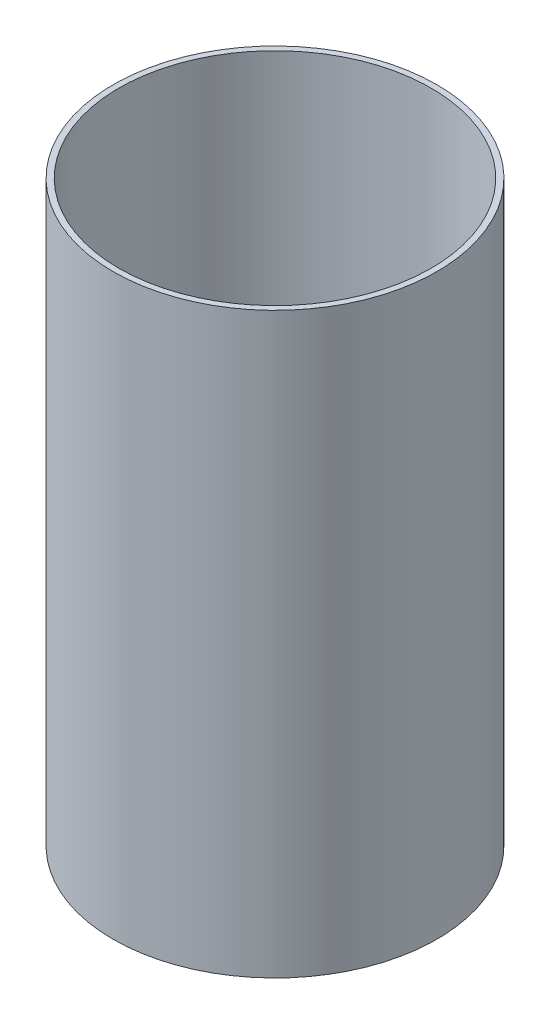
ISO-10303-21;
HEADER;
FILE_DESCRIPTION(('STEP AP214'),'2;1');
FILE_NAME('part.step','',(''),(''),'','','');
FILE_SCHEMA(('AUTOMOTIVE_DESIGN { 1 0 10303 214 1 1 1 1 }'));
ENDSEC;
DATA;
#1=APPLICATION_CONTEXT('core data for automotive mechanical design processes');
#2=APPLICATION_PROTOCOL_DEFINITION('international standard','automotive_design',2000,#1);
#3=PRODUCT_CONTEXT('',#1,'mechanical');
#4=PRODUCT('Part','Part','',(#3));
#5=PRODUCT_RELATED_PRODUCT_CATEGORY('part','',(#4));
#6=PRODUCT_DEFINITION_FORMATION('','',#4);
#7=PRODUCT_DEFINITION_CONTEXT('part definition',#1,'design');
#8=PRODUCT_DEFINITION('design','',#6,#7);
#9=PRODUCT_DEFINITION_SHAPE('','',#8);
#10=(LENGTH_UNIT() NAMED_UNIT(*) SI_UNIT(.MILLI.,.METRE.));
#11=(NAMED_UNIT(*) PLANE_ANGLE_UNIT() SI_UNIT($,.RADIAN.));
#12=(NAMED_UNIT(*) SI_UNIT($,.STERADIAN.) SOLID_ANGLE_UNIT());
#13=UNCERTAINTY_MEASURE_WITH_UNIT(LENGTH_MEASURE(1.E-05),#10,'distance_accuracy_value','');
#14=(GEOMETRIC_REPRESENTATION_CONTEXT(3) GLOBAL_UNCERTAINTY_ASSIGNED_CONTEXT((#13)) GLOBAL_UNIT_ASSIGNED_CONTEXT((#10,
#11,#12)) REPRESENTATION_CONTEXT('',''));
#15=CARTESIAN_POINT('',(0.,0.,0.));
#16=DIRECTION('',(0.,0.,1.));
#17=DIRECTION('',(1.,0.,0.));
#18=AXIS2_PLACEMENT_3D('',#15,#16,#17);
#19=CARTESIAN_POINT('',(0.,50.,0.));
#20=DIRECTION('',(0.,1.,0.));
#21=DIRECTION('',(0.,0.,1.));
#22=AXIS2_PLACEMENT_3D('',#19,#20,#21);
#23=PLANE('',#22);
#24=CARTESIAN_POINT('',(0.,50.,0.));
#25=DIRECTION('',(0.,1.,0.));
#26=DIRECTION('',(0.,0.,1.));
#27=AXIS2_PLACEMENT_3D('',#24,#25,#26);
#28=CIRCLE('',#27,14.);
#29=CARTESIAN_POINT('',(0.,50.,14.));
#30=VERTEX_POINT('',#29);
#31=EDGE_CURVE('E10',#30,#30,#28,.T.);
#32=ORIENTED_EDGE('',*,*,#31,.T.);
#33=EDGE_LOOP('',(#32));
#34=FACE_BOUND('',#33,.T.);
#35=CARTESIAN_POINT('',(0.,50.,0.));
#36=DIRECTION('',(0.,1.,0.));
#37=DIRECTION('',(0.,0.,1.));
#38=AXIS2_PLACEMENT_3D('',#35,#36,#37);
#39=CIRCLE('',#38,13.5);
#40=CARTESIAN_POINT('',(0.,50.,13.5));
#41=VERTEX_POINT('',#40);
#42=EDGE_CURVE('E42',#41,#41,#39,.T.);
#43=ORIENTED_EDGE('',*,*,#42,.F.);
#44=EDGE_LOOP('',(#43));
#45=FACE_BOUND('',#44,.T.);
#46=ADVANCED_FACE('F31',(#34,#45),#23,.T.);
#47=CARTESIAN_POINT('',(0.,0.,0.));
#48=DIRECTION('',(0.,1.,0.));
#49=DIRECTION('',(0.,0.,1.));
#50=AXIS2_PLACEMENT_3D('',#47,#48,#49);
#51=PLANE('',#50);
#52=CARTESIAN_POINT('',(0.,0.,0.));
#53=DIRECTION('',(0.,1.,0.));
#54=DIRECTION('',(0.,0.,1.));
#55=AXIS2_PLACEMENT_3D('',#52,#53,#54);
#56=CIRCLE('',#55,14.);
#57=CARTESIAN_POINT('',(0.,0.,14.));
#58=VERTEX_POINT('',#57);
#59=EDGE_CURVE('E35',#58,#58,#56,.T.);
#60=ORIENTED_EDGE('',*,*,#59,.F.);
#61=EDGE_LOOP('',(#60));
#62=FACE_BOUND('',#61,.T.);
#63=CARTESIAN_POINT('',(0.,0.,0.));
#64=DIRECTION('',(0.,1.,0.));
#65=DIRECTION('',(0.,0.,1.));
#66=AXIS2_PLACEMENT_3D('',#63,#64,#65);
#67=CIRCLE('',#66,13.5);
#68=CARTESIAN_POINT('',(0.,0.,13.5));
#69=VERTEX_POINT('',#68);
#70=EDGE_CURVE('E44',#69,#69,#67,.T.);
#71=ORIENTED_EDGE('',*,*,#70,.T.);
#72=EDGE_LOOP('',(#71));
#73=FACE_BOUND('',#72,.T.);
#74=ADVANCED_FACE('F54',(#62,#73),#51,.F.);
#75=CARTESIAN_POINT('',(0.,50.,0.));
#76=DIRECTION('',(0.,-1.,0.));
#77=DIRECTION('',(0.,0.,-1.));
#78=AXIS2_PLACEMENT_3D('',#75,#76,#77);
#79=CYLINDRICAL_SURFACE('',#78,14.);
#80=ORIENTED_EDGE('',*,*,#31,.F.);
#81=EDGE_LOOP('',(#80));
#82=FACE_BOUND('',#81,.T.);
#83=ORIENTED_EDGE('',*,*,#59,.T.);
#84=EDGE_LOOP('',(#83));
#85=FACE_BOUND('',#84,.T.);
#86=ADVANCED_FACE('F33',(#82,#85),#79,.T.);
#87=CARTESIAN_POINT('',(0.,50.,0.));
#88=DIRECTION('',(0.,-1.,0.));
#89=DIRECTION('',(0.,0.,-1.));
#90=AXIS2_PLACEMENT_3D('',#87,#88,#89);
#91=CYLINDRICAL_SURFACE('',#90,13.5);
#92=ORIENTED_EDGE('',*,*,#42,.T.);
#93=EDGE_LOOP('',(#92));
#94=FACE_BOUND('',#93,.T.);
#95=ORIENTED_EDGE('',*,*,#70,.F.);
#96=EDGE_LOOP('',(#95));
#97=FACE_BOUND('',#96,.T.);
#98=ADVANCED_FACE('F50',(#94,#97),#91,.F.);
#99=CLOSED_SHELL('',(#46,#74,#86,#98));
#100=MANIFOLD_SOLID_BREP('B2',#99);
#101=ADVANCED_BREP_SHAPE_REPRESENTATION('',(#18,#100),#14);
#102=SHAPE_DEFINITION_REPRESENTATION(#9,#101);
ENDSEC;
END-ISO-10303-21;
